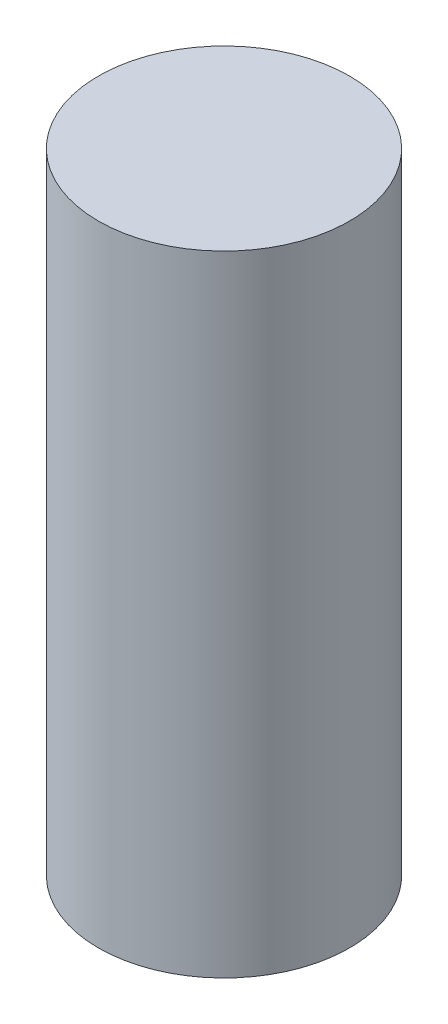
ISO-10303-21;
HEADER;
FILE_DESCRIPTION(('STEP AP214'),'2;1');
FILE_NAME('part.step','',(''),(''),'','','');
FILE_SCHEMA(('AUTOMOTIVE_DESIGN { 1 0 10303 214 1 1 1 1 }'));
ENDSEC;
DATA;
#1=APPLICATION_CONTEXT('core data for automotive mechanical design processes');
#2=APPLICATION_PROTOCOL_DEFINITION('international standard','automotive_design',2000,#1);
#3=PRODUCT_CONTEXT('',#1,'mechanical');
#4=PRODUCT('Part','Part','',(#3));
#5=PRODUCT_RELATED_PRODUCT_CATEGORY('part','',(#4));
#6=PRODUCT_DEFINITION_FORMATION('','',#4);
#7=PRODUCT_DEFINITION_CONTEXT('part definition',#1,'design');
#8=PRODUCT_DEFINITION('design','',#6,#7);
#9=PRODUCT_DEFINITION_SHAPE('','',#8);
#10=(LENGTH_UNIT() NAMED_UNIT(*) SI_UNIT(.MILLI.,.METRE.));
#11=(NAMED_UNIT(*) PLANE_ANGLE_UNIT() SI_UNIT($,.RADIAN.));
#12=(NAMED_UNIT(*) SI_UNIT($,.STERADIAN.) SOLID_ANGLE_UNIT());
#13=UNCERTAINTY_MEASURE_WITH_UNIT(LENGTH_MEASURE(1.E-05),#10,'distance_accuracy_value','');
#14=(GEOMETRIC_REPRESENTATION_CONTEXT(3) GLOBAL_UNCERTAINTY_ASSIGNED_CONTEXT((#13)) GLOBAL_UNIT_ASSIGNED_CONTEXT((#10,
#11,#12)) REPRESENTATION_CONTEXT('',''));
#15=CARTESIAN_POINT('',(0.,0.,0.));
#16=DIRECTION('',(0.,0.,1.));
#17=DIRECTION('',(1.,0.,0.));
#18=AXIS2_PLACEMENT_3D('',#15,#16,#17);
#19=CARTESIAN_POINT('',(0.,65.15,0.));
#20=DIRECTION('',(0.,-1.,0.));
#21=DIRECTION('',(0.,0.,-1.));
#22=AXIS2_PLACEMENT_3D('',#19,#20,#21);
#23=CYLINDRICAL_SURFACE('',#22,13.);
#24=CARTESIAN_POINT('',(0.,65.15,0.));
#25=DIRECTION('',(0.,1.,0.));
#26=DIRECTION('',(0.,0.,1.));
#27=AXIS2_PLACEMENT_3D('',#24,#25,#26);
#28=CIRCLE('',#27,13.);
#29=CARTESIAN_POINT('',(0.,65.15,13.));
#30=VERTEX_POINT('',#29);
#31=EDGE_CURVE('E10',#30,#30,#28,.T.);
#32=ORIENTED_EDGE('',*,*,#31,.F.);
#33=EDGE_LOOP('',(#32));
#34=FACE_BOUND('',#33,.T.);
#35=CARTESIAN_POINT('',(0.,0.,0.));
#36=DIRECTION('',(0.,1.,0.));
#37=DIRECTION('',(0.,0.,1.));
#38=AXIS2_PLACEMENT_3D('',#35,#36,#37);
#39=CIRCLE('',#38,13.);
#40=CARTESIAN_POINT('',(0.,0.,13.));
#41=VERTEX_POINT('',#40);
#42=EDGE_CURVE('E33',#41,#41,#39,.T.);
#43=ORIENTED_EDGE('',*,*,#42,.T.);
#44=EDGE_LOOP('',(#43));
#45=FACE_BOUND('',#44,.T.);
#46=ADVANCED_FACE('F30',(#34,#45),#23,.T.);
#47=CARTESIAN_POINT('',(0.,65.15,0.));
#48=DIRECTION('',(0.,1.,0.));
#49=DIRECTION('',(0.,0.,1.));
#50=AXIS2_PLACEMENT_3D('',#47,#48,#49);
#51=PLANE('',#50);
#52=ORIENTED_EDGE('',*,*,#31,.T.);
#53=EDGE_LOOP('',(#52));
#54=FACE_BOUND('',#53,.T.);
#55=ADVANCED_FACE('F45',(#54),#51,.T.);
#56=CARTESIAN_POINT('',(0.,0.,0.));
#57=DIRECTION('',(0.,1.,0.));
#58=DIRECTION('',(0.,0.,1.));
#59=AXIS2_PLACEMENT_3D('',#56,#57,#58);
#60=PLANE('',#59);
#61=ORIENTED_EDGE('',*,*,#42,.F.);
#62=EDGE_LOOP('',(#61));
#63=FACE_BOUND('',#62,.T.);
#64=ADVANCED_FACE('F43',(#63),#60,.F.);
#65=CLOSED_SHELL('',(#46,#55,#64));
#66=MANIFOLD_SOLID_BREP('B2',#65);
#67=ADVANCED_BREP_SHAPE_REPRESENTATION('',(#18,#66),#14);
#68=SHAPE_DEFINITION_REPRESENTATION(#9,#67);
ENDSEC;
END-ISO-10303-21;
